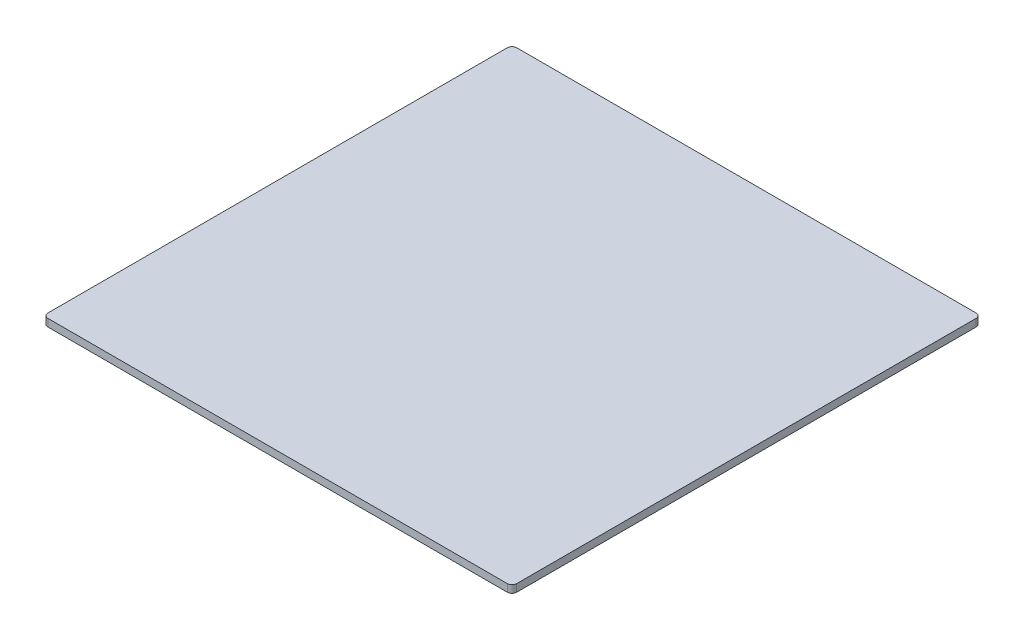
ISO-10303-21;
HEADER;
FILE_DESCRIPTION(('STEP AP214'),'2;1');
FILE_NAME('part.step','',(''),(''),'','','');
FILE_SCHEMA(('AUTOMOTIVE_DESIGN { 1 0 10303 214 1 1 1 1 }'));
ENDSEC;
DATA;
#1=APPLICATION_CONTEXT('core data for automotive mechanical design processes');
#2=APPLICATION_PROTOCOL_DEFINITION('international standard','automotive_design',2000,#1);
#3=PRODUCT_CONTEXT('',#1,'mechanical');
#4=PRODUCT('Part','Part','',(#3));
#5=PRODUCT_RELATED_PRODUCT_CATEGORY('part','',(#4));
#6=PRODUCT_DEFINITION_FORMATION('','',#4);
#7=PRODUCT_DEFINITION_CONTEXT('part definition',#1,'design');
#8=PRODUCT_DEFINITION('design','',#6,#7);
#9=PRODUCT_DEFINITION_SHAPE('','',#8);
#10=(LENGTH_UNIT() NAMED_UNIT(*) SI_UNIT(.MILLI.,.METRE.));
#11=(NAMED_UNIT(*) PLANE_ANGLE_UNIT() SI_UNIT($,.RADIAN.));
#12=(NAMED_UNIT(*) SI_UNIT($,.STERADIAN.) SOLID_ANGLE_UNIT());
#13=UNCERTAINTY_MEASURE_WITH_UNIT(LENGTH_MEASURE(1.E-05),#10,'distance_accuracy_value','');
#14=(GEOMETRIC_REPRESENTATION_CONTEXT(3) GLOBAL_UNCERTAINTY_ASSIGNED_CONTEXT((#13)) GLOBAL_UNIT_ASSIGNED_CONTEXT((#10,
#11,#12)) REPRESENTATION_CONTEXT('',''));
#15=CARTESIAN_POINT('',(0.,0.,0.));
#16=DIRECTION('',(0.,0.,1.));
#17=DIRECTION('',(1.,0.,0.));
#18=AXIS2_PLACEMENT_3D('',#15,#16,#17);
#19=CARTESIAN_POINT('',(50.,0.8,50.));
#20=DIRECTION('',(-1.,0.,0.));
#21=DIRECTION('',(0.,0.,1.));
#22=AXIS2_PLACEMENT_3D('',#19,#20,#21);
#23=PLANE('',#22);
#24=DIRECTION('',(0.,0.,-1.));
#25=VECTOR('',#24,1.);
#26=CARTESIAN_POINT('',(50.,0.8,50.));
#27=LINE('',#26,#25);
#28=CARTESIAN_POINT('',(50.,0.8,49.));
#29=VERTEX_POINT('',#28);
#30=CARTESIAN_POINT('',(50.,0.8,-49.));
#31=VERTEX_POINT('',#30);
#32=EDGE_CURVE('E125',#29,#31,#27,.T.);
#33=ORIENTED_EDGE('',*,*,#32,.F.);
#34=DIRECTION('',(0.,-1.,0.));
#35=VECTOR('',#34,1.);
#36=CARTESIAN_POINT('',(50.,0.8,49.));
#37=LINE('',#36,#35);
#38=CARTESIAN_POINT('',(50.,-0.8,49.));
#39=VERTEX_POINT('',#38);
#40=EDGE_CURVE('E110',#29,#39,#37,.T.);
#41=ORIENTED_EDGE('',*,*,#40,.T.);
#42=DIRECTION('',(0.,0.,-1.));
#43=VECTOR('',#42,1.);
#44=CARTESIAN_POINT('',(50.,-0.8,50.));
#45=LINE('',#44,#43);
#46=CARTESIAN_POINT('',(50.,-0.8,-49.));
#47=VERTEX_POINT('',#46);
#48=EDGE_CURVE('E122',#39,#47,#45,.T.);
#49=ORIENTED_EDGE('',*,*,#48,.T.);
#50=DIRECTION('',(0.,-1.,0.));
#51=VECTOR('',#50,1.);
#52=CARTESIAN_POINT('',(50.,0.8,-49.));
#53=LINE('',#52,#51);
#54=EDGE_CURVE('E127',#47,#31,#53,.F.);
#55=ORIENTED_EDGE('',*,*,#54,.T.);
#56=EDGE_LOOP('',(#33,#41,#49,#55));
#57=FACE_BOUND('',#56,.T.);
#58=ADVANCED_FACE('F40',(#57),#23,.F.);
#59=CARTESIAN_POINT('',(-50.,0.8,-50.));
#60=DIRECTION('',(0.,0.,1.));
#61=DIRECTION('',(1.,0.,0.));
#62=AXIS2_PLACEMENT_3D('',#59,#60,#61);
#63=PLANE('',#62);
#64=DIRECTION('',(-1.,0.,0.));
#65=VECTOR('',#64,1.);
#66=CARTESIAN_POINT('',(-50.,-0.8,-50.));
#67=LINE('',#66,#65);
#68=CARTESIAN_POINT('',(49.,-0.8,-50.));
#69=VERTEX_POINT('',#68);
#70=CARTESIAN_POINT('',(-49.,-0.8,-50.));
#71=VERTEX_POINT('',#70);
#72=EDGE_CURVE('E132',#69,#71,#67,.T.);
#73=ORIENTED_EDGE('',*,*,#72,.T.);
#74=DIRECTION('',(0.,-1.,0.));
#75=VECTOR('',#74,1.);
#76=CARTESIAN_POINT('',(-49.,0.8,-50.));
#77=LINE('',#76,#75);
#78=CARTESIAN_POINT('',(-49.,0.8,-50.));
#79=VERTEX_POINT('',#78);
#80=EDGE_CURVE('E11',#71,#79,#77,.F.);
#81=ORIENTED_EDGE('',*,*,#80,.T.);
#82=DIRECTION('',(-1.,0.,0.));
#83=VECTOR('',#82,1.);
#84=CARTESIAN_POINT('',(-50.,0.8,-50.));
#85=LINE('',#84,#83);
#86=CARTESIAN_POINT('',(49.,0.8,-50.));
#87=VERTEX_POINT('',#86);
#88=EDGE_CURVE('E167',#87,#79,#85,.T.);
#89=ORIENTED_EDGE('',*,*,#88,.F.);
#90=DIRECTION('',(0.,-1.,0.));
#91=VECTOR('',#90,1.);
#92=CARTESIAN_POINT('',(49.,0.8,-50.));
#93=LINE('',#92,#91);
#94=EDGE_CURVE('E48',#87,#69,#93,.T.);
#95=ORIENTED_EDGE('',*,*,#94,.T.);
#96=EDGE_LOOP('',(#73,#81,#89,#95));
#97=FACE_BOUND('',#96,.T.);
#98=ADVANCED_FACE('F165',(#97),#63,.F.);
#99=CARTESIAN_POINT('',(-50.,0.8,50.));
#100=DIRECTION('',(1.,0.,0.));
#101=DIRECTION('',(0.,0.,-1.));
#102=AXIS2_PLACEMENT_3D('',#99,#100,#101);
#103=PLANE('',#102);
#104=DIRECTION('',(0.,0.,1.));
#105=VECTOR('',#104,1.);
#106=CARTESIAN_POINT('',(-50.,0.8,50.));
#107=LINE('',#106,#105);
#108=CARTESIAN_POINT('',(-50.,0.8,-49.));
#109=VERTEX_POINT('',#108);
#110=CARTESIAN_POINT('',(-50.,0.8,49.));
#111=VERTEX_POINT('',#110);
#112=EDGE_CURVE('E175',#109,#111,#107,.T.);
#113=ORIENTED_EDGE('',*,*,#112,.F.);
#114=DIRECTION('',(0.,-1.,0.));
#115=VECTOR('',#114,1.);
#116=CARTESIAN_POINT('',(-50.,0.8,-49.));
#117=LINE('',#116,#115);
#118=CARTESIAN_POINT('',(-50.,-0.8,-49.));
#119=VERTEX_POINT('',#118);
#120=EDGE_CURVE('E159',#109,#119,#117,.T.);
#121=ORIENTED_EDGE('',*,*,#120,.T.);
#122=DIRECTION('',(0.,0.,1.));
#123=VECTOR('',#122,1.);
#124=CARTESIAN_POINT('',(-50.,-0.8,50.));
#125=LINE('',#124,#123);
#126=CARTESIAN_POINT('',(-50.,-0.8,49.));
#127=VERTEX_POINT('',#126);
#128=EDGE_CURVE('E135',#119,#127,#125,.T.);
#129=ORIENTED_EDGE('',*,*,#128,.T.);
#130=DIRECTION('',(0.,-1.,0.));
#131=VECTOR('',#130,1.);
#132=CARTESIAN_POINT('',(-50.,0.8,49.));
#133=LINE('',#132,#131);
#134=EDGE_CURVE('E55',#127,#111,#133,.F.);
#135=ORIENTED_EDGE('',*,*,#134,.T.);
#136=EDGE_LOOP('',(#113,#121,#129,#135));
#137=FACE_BOUND('',#136,.T.);
#138=ADVANCED_FACE('F174',(#137),#103,.F.);
#139=CARTESIAN_POINT('',(-50.,0.8,50.));
#140=DIRECTION('',(0.,0.,-1.));
#141=DIRECTION('',(-1.,0.,0.));
#142=AXIS2_PLACEMENT_3D('',#139,#140,#141);
#143=PLANE('',#142);
#144=DIRECTION('',(1.,0.,0.));
#145=VECTOR('',#144,1.);
#146=CARTESIAN_POINT('',(-50.,-0.8,50.));
#147=LINE('',#146,#145);
#148=CARTESIAN_POINT('',(-49.,-0.8,50.));
#149=VERTEX_POINT('',#148);
#150=CARTESIAN_POINT('',(49.,-0.8,50.));
#151=VERTEX_POINT('',#150);
#152=EDGE_CURVE('E142',#149,#151,#147,.T.);
#153=ORIENTED_EDGE('',*,*,#152,.T.);
#154=DIRECTION('',(0.,-1.,0.));
#155=VECTOR('',#154,1.);
#156=CARTESIAN_POINT('',(49.,0.8,50.));
#157=LINE('',#156,#155);
#158=CARTESIAN_POINT('',(49.,0.8,50.));
#159=VERTEX_POINT('',#158);
#160=EDGE_CURVE('E111',#151,#159,#157,.F.);
#161=ORIENTED_EDGE('',*,*,#160,.T.);
#162=DIRECTION('',(1.,0.,0.));
#163=VECTOR('',#162,1.);
#164=CARTESIAN_POINT('',(-50.,0.8,50.));
#165=LINE('',#164,#163);
#166=CARTESIAN_POINT('',(-49.,0.8,50.));
#167=VERTEX_POINT('',#166);
#168=EDGE_CURVE('E138',#167,#159,#165,.T.);
#169=ORIENTED_EDGE('',*,*,#168,.F.);
#170=DIRECTION('',(0.,-1.,0.));
#171=VECTOR('',#170,1.);
#172=CARTESIAN_POINT('',(-49.,0.8,50.));
#173=LINE('',#172,#171);
#174=EDGE_CURVE('E116',#167,#149,#173,.T.);
#175=ORIENTED_EDGE('',*,*,#174,.T.);
#176=EDGE_LOOP('',(#153,#161,#169,#175));
#177=FACE_BOUND('',#176,.T.);
#178=ADVANCED_FACE('F205',(#177),#143,.F.);
#179=CARTESIAN_POINT('',(0.,0.8,0.));
#180=DIRECTION('',(0.,-1.,0.));
#181=DIRECTION('',(0.,0.,-1.));
#182=AXIS2_PLACEMENT_3D('',#179,#180,#181);
#183=PLANE('',#182);
#184=ORIENTED_EDGE('',*,*,#168,.T.);
#185=CARTESIAN_POINT('',(49.,0.8,49.));
#186=DIRECTION('',(0.,-1.,0.));
#187=DIRECTION('',(0.,0.,-1.));
#188=AXIS2_PLACEMENT_3D('',#185,#186,#187);
#189=CIRCLE('',#188,1.);
#190=EDGE_CURVE('E156',#159,#29,#189,.F.);
#191=ORIENTED_EDGE('',*,*,#190,.T.);
#192=ORIENTED_EDGE('',*,*,#32,.T.);
#193=CARTESIAN_POINT('',(49.,0.8,-49.));
#194=DIRECTION('',(0.,-1.,0.));
#195=DIRECTION('',(0.,0.,-1.));
#196=AXIS2_PLACEMENT_3D('',#193,#194,#195);
#197=CIRCLE('',#196,1.);
#198=EDGE_CURVE('E153',#31,#87,#197,.F.);
#199=ORIENTED_EDGE('',*,*,#198,.T.);
#200=ORIENTED_EDGE('',*,*,#88,.T.);
#201=CARTESIAN_POINT('',(-49.,0.8,-49.));
#202=DIRECTION('',(0.,-1.,0.));
#203=DIRECTION('',(0.,0.,-1.));
#204=AXIS2_PLACEMENT_3D('',#201,#202,#203);
#205=CIRCLE('',#204,1.);
#206=EDGE_CURVE('E62',#79,#109,#205,.F.);
#207=ORIENTED_EDGE('',*,*,#206,.T.);
#208=ORIENTED_EDGE('',*,*,#112,.T.);
#209=CARTESIAN_POINT('',(-49.,0.8,49.));
#210=DIRECTION('',(0.,-1.,0.));
#211=DIRECTION('',(0.,0.,-1.));
#212=AXIS2_PLACEMENT_3D('',#209,#210,#211);
#213=CIRCLE('',#212,1.);
#214=EDGE_CURVE('E151',#111,#167,#213,.F.);
#215=ORIENTED_EDGE('',*,*,#214,.T.);
#216=EDGE_LOOP('',(#184,#191,#192,#199,#200,#207,#208,#215));
#217=FACE_BOUND('',#216,.T.);
#218=ADVANCED_FACE('F180',(#217),#183,.F.);
#219=CARTESIAN_POINT('',(0.,-0.8,0.));
#220=DIRECTION('',(0.,-1.,0.));
#221=DIRECTION('',(0.,0.,-1.));
#222=AXIS2_PLACEMENT_3D('',#219,#220,#221);
#223=PLANE('',#222);
#224=ORIENTED_EDGE('',*,*,#48,.F.);
#225=CARTESIAN_POINT('',(49.,-0.8,49.));
#226=DIRECTION('',(0.,-1.,0.));
#227=DIRECTION('',(0.,0.,-1.));
#228=AXIS2_PLACEMENT_3D('',#225,#226,#227);
#229=CIRCLE('',#228,1.);
#230=EDGE_CURVE('E106',#39,#151,#229,.T.);
#231=ORIENTED_EDGE('',*,*,#230,.T.);
#232=ORIENTED_EDGE('',*,*,#152,.F.);
#233=CARTESIAN_POINT('',(-49.,-0.8,49.));
#234=DIRECTION('',(0.,-1.,0.));
#235=DIRECTION('',(0.,0.,-1.));
#236=AXIS2_PLACEMENT_3D('',#233,#234,#235);
#237=CIRCLE('',#236,1.);
#238=EDGE_CURVE('E126',#149,#127,#237,.T.);
#239=ORIENTED_EDGE('',*,*,#238,.T.);
#240=ORIENTED_EDGE('',*,*,#128,.F.);
#241=CARTESIAN_POINT('',(-49.,-0.8,-49.));
#242=DIRECTION('',(0.,-1.,0.));
#243=DIRECTION('',(0.,0.,-1.));
#244=AXIS2_PLACEMENT_3D('',#241,#242,#243);
#245=CIRCLE('',#244,1.);
#246=EDGE_CURVE('E117',#119,#71,#245,.T.);
#247=ORIENTED_EDGE('',*,*,#246,.T.);
#248=ORIENTED_EDGE('',*,*,#72,.F.);
#249=CARTESIAN_POINT('',(49.,-0.8,-49.));
#250=DIRECTION('',(0.,-1.,0.));
#251=DIRECTION('',(0.,0.,-1.));
#252=AXIS2_PLACEMENT_3D('',#249,#250,#251);
#253=CIRCLE('',#252,1.);
#254=EDGE_CURVE('E131',#69,#47,#253,.T.);
#255=ORIENTED_EDGE('',*,*,#254,.T.);
#256=EDGE_LOOP('',(#224,#231,#232,#239,#240,#247,#248,#255));
#257=FACE_BOUND('',#256,.T.);
#258=ADVANCED_FACE('F129',(#257),#223,.T.);
#259=CARTESIAN_POINT('',(49.,0.8,49.));
#260=DIRECTION('',(0.,-1.,0.));
#261=DIRECTION('',(0.,0.,-1.));
#262=AXIS2_PLACEMENT_3D('',#259,#260,#261);
#263=CYLINDRICAL_SURFACE('',#262,1.);
#264=ORIENTED_EDGE('',*,*,#190,.F.);
#265=ORIENTED_EDGE('',*,*,#160,.F.);
#266=ORIENTED_EDGE('',*,*,#230,.F.);
#267=ORIENTED_EDGE('',*,*,#40,.F.);
#268=EDGE_LOOP('',(#264,#265,#266,#267));
#269=FACE_BOUND('',#268,.T.);
#270=ADVANCED_FACE('F109',(#269),#263,.T.);
#271=CARTESIAN_POINT('',(-49.,0.8,-49.));
#272=DIRECTION('',(0.,-1.,0.));
#273=DIRECTION('',(0.,0.,-1.));
#274=AXIS2_PLACEMENT_3D('',#271,#272,#273);
#275=CYLINDRICAL_SURFACE('',#274,1.);
#276=ORIENTED_EDGE('',*,*,#206,.F.);
#277=ORIENTED_EDGE('',*,*,#80,.F.);
#278=ORIENTED_EDGE('',*,*,#246,.F.);
#279=ORIENTED_EDGE('',*,*,#120,.F.);
#280=EDGE_LOOP('',(#276,#277,#278,#279));
#281=FACE_BOUND('',#280,.T.);
#282=ADVANCED_FACE('F173',(#281),#275,.T.);
#283=CARTESIAN_POINT('',(49.,0.8,-49.));
#284=DIRECTION('',(0.,-1.,0.));
#285=DIRECTION('',(0.,0.,-1.));
#286=AXIS2_PLACEMENT_3D('',#283,#284,#285);
#287=CYLINDRICAL_SURFACE('',#286,1.);
#288=ORIENTED_EDGE('',*,*,#198,.F.);
#289=ORIENTED_EDGE('',*,*,#54,.F.);
#290=ORIENTED_EDGE('',*,*,#254,.F.);
#291=ORIENTED_EDGE('',*,*,#94,.F.);
#292=EDGE_LOOP('',(#288,#289,#290,#291));
#293=FACE_BOUND('',#292,.T.);
#294=ADVANCED_FACE('F181',(#293),#287,.T.);
#295=CARTESIAN_POINT('',(-49.,0.8,49.));
#296=DIRECTION('',(0.,-1.,0.));
#297=DIRECTION('',(0.,0.,-1.));
#298=AXIS2_PLACEMENT_3D('',#295,#296,#297);
#299=CYLINDRICAL_SURFACE('',#298,1.);
#300=ORIENTED_EDGE('',*,*,#214,.F.);
#301=ORIENTED_EDGE('',*,*,#134,.F.);
#302=ORIENTED_EDGE('',*,*,#238,.F.);
#303=ORIENTED_EDGE('',*,*,#174,.F.);
#304=EDGE_LOOP('',(#300,#301,#302,#303));
#305=FACE_BOUND('',#304,.T.);
#306=ADVANCED_FACE('F42',(#305),#299,.T.);
#307=CLOSED_SHELL('',(#58,#98,#138,#178,#218,#258,#270,#282,#294,#306));
#308=MANIFOLD_SOLID_BREP('B2',#307);
#309=ADVANCED_BREP_SHAPE_REPRESENTATION('',(#18,#308),#14);
#310=SHAPE_DEFINITION_REPRESENTATION(#9,#309);
ENDSEC;
END-ISO-10303-21;
